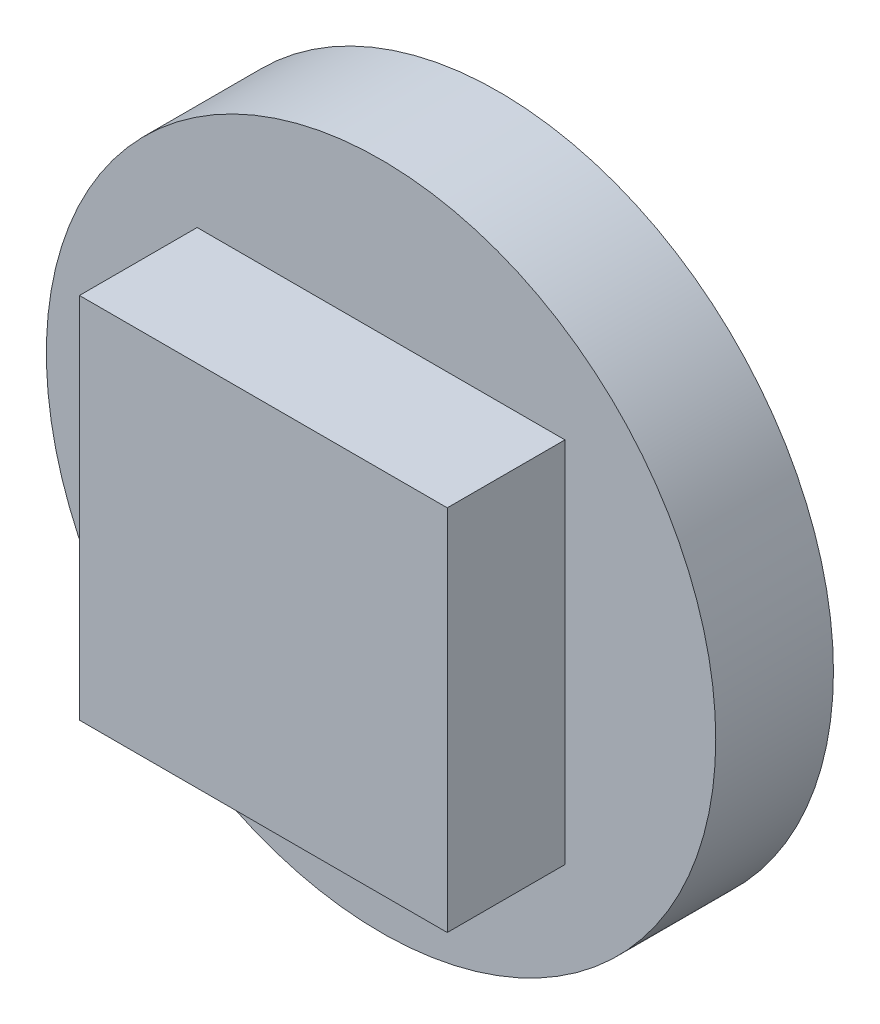
ISO-10303-21;
HEADER;
FILE_DESCRIPTION(('STEP AP214'),'2;1');
FILE_NAME('part.step','',(''),(''),'','','');
FILE_SCHEMA(('AUTOMOTIVE_DESIGN { 1 0 10303 214 1 1 1 1 }'));
ENDSEC;
DATA;
#1=APPLICATION_CONTEXT('core data for automotive mechanical design processes');
#2=APPLICATION_PROTOCOL_DEFINITION('international standard','automotive_design',2000,#1);
#3=PRODUCT_CONTEXT('',#1,'mechanical');
#4=PRODUCT('Part','Part','',(#3));
#5=PRODUCT_RELATED_PRODUCT_CATEGORY('part','',(#4));
#6=PRODUCT_DEFINITION_FORMATION('','',#4);
#7=PRODUCT_DEFINITION_CONTEXT('part definition',#1,'design');
#8=PRODUCT_DEFINITION('design','',#6,#7);
#9=PRODUCT_DEFINITION_SHAPE('','',#8);
#10=(LENGTH_UNIT() NAMED_UNIT(*) SI_UNIT(.MILLI.,.METRE.));
#11=(NAMED_UNIT(*) PLANE_ANGLE_UNIT() SI_UNIT($,.RADIAN.));
#12=(NAMED_UNIT(*) SI_UNIT($,.STERADIAN.) SOLID_ANGLE_UNIT());
#13=UNCERTAINTY_MEASURE_WITH_UNIT(LENGTH_MEASURE(1.E-05),#10,'distance_accuracy_value','');
#14=(GEOMETRIC_REPRESENTATION_CONTEXT(3) GLOBAL_UNCERTAINTY_ASSIGNED_CONTEXT((#13)) GLOBAL_UNIT_ASSIGNED_CONTEXT((#10,
#11,#12)) REPRESENTATION_CONTEXT('',''));
#15=CARTESIAN_POINT('',(0.,0.,0.));
#16=DIRECTION('',(0.,0.,1.));
#17=DIRECTION('',(1.,0.,0.));
#18=AXIS2_PLACEMENT_3D('',#15,#16,#17);
#19=CARTESIAN_POINT('',(0.,0.,1.6));
#20=DIRECTION('',(0.,0.,-1.));
#21=DIRECTION('',(-1.,0.,0.));
#22=AXIS2_PLACEMENT_3D('',#19,#20,#21);
#23=CYLINDRICAL_SURFACE('',#22,4.55);
#24=CARTESIAN_POINT('',(0.,0.,1.6));
#25=DIRECTION('',(0.,0.,1.));
#26=DIRECTION('',(1.,0.,0.));
#27=AXIS2_PLACEMENT_3D('',#24,#25,#26);
#28=CIRCLE('',#27,4.55);
#29=CARTESIAN_POINT('',(4.55,0.,1.6));
#30=VERTEX_POINT('',#29);
#31=EDGE_CURVE('E11',#30,#30,#28,.T.);
#32=ORIENTED_EDGE('',*,*,#31,.F.);
#33=EDGE_LOOP('',(#32));
#34=FACE_BOUND('',#33,.T.);
#35=CARTESIAN_POINT('',(0.,0.,0.));
#36=DIRECTION('',(0.,0.,1.));
#37=DIRECTION('',(1.,0.,0.));
#38=AXIS2_PLACEMENT_3D('',#35,#36,#37);
#39=CIRCLE('',#38,4.55);
#40=CARTESIAN_POINT('',(4.55,0.,0.));
#41=VERTEX_POINT('',#40);
#42=EDGE_CURVE('E40',#41,#41,#39,.T.);
#43=ORIENTED_EDGE('',*,*,#42,.T.);
#44=EDGE_LOOP('',(#43));
#45=FACE_BOUND('',#44,.T.);
#46=ADVANCED_FACE('F37',(#34,#45),#23,.T.);
#47=CARTESIAN_POINT('',(0.,0.,1.6));
#48=DIRECTION('',(0.,0.,1.));
#49=DIRECTION('',(1.,0.,0.));
#50=AXIS2_PLACEMENT_3D('',#47,#48,#49);
#51=PLANE('',#50);
#52=DIRECTION('',(0.,1.,0.));
#53=VECTOR('',#52,1.);
#54=CARTESIAN_POINT('',(2.5,2.5,1.6));
#55=LINE('',#54,#53);
#56=CARTESIAN_POINT('',(2.50000000000001,-2.50000000000001,1.6));
#57=VERTEX_POINT('',#56);
#58=CARTESIAN_POINT('',(2.5,2.5,1.6));
#59=VERTEX_POINT('',#58);
#60=EDGE_CURVE('E51',#57,#59,#55,.T.);
#61=ORIENTED_EDGE('',*,*,#60,.F.);
#62=DIRECTION('',(1.,0.,0.));
#63=VECTOR('',#62,1.);
#64=CARTESIAN_POINT('',(-2.5,-2.50000000000001,1.6));
#65=LINE('',#64,#63);
#66=CARTESIAN_POINT('',(-2.5,-2.50000000000001,1.6));
#67=VERTEX_POINT('',#66);
#68=EDGE_CURVE('E55',#67,#57,#65,.T.);
#69=ORIENTED_EDGE('',*,*,#68,.F.);
#70=DIRECTION('',(0.,-1.,0.));
#71=VECTOR('',#70,1.);
#72=CARTESIAN_POINT('',(-2.5,2.5,1.6));
#73=LINE('',#72,#71);
#74=CARTESIAN_POINT('',(-2.5,2.5,1.6));
#75=VERTEX_POINT('',#74);
#76=EDGE_CURVE('E107',#75,#67,#73,.T.);
#77=ORIENTED_EDGE('',*,*,#76,.F.);
#78=DIRECTION('',(-1.,0.,0.));
#79=VECTOR('',#78,1.);
#80=CARTESIAN_POINT('',(-2.5,2.5,1.6));
#81=LINE('',#80,#79);
#82=EDGE_CURVE('E109',#59,#75,#81,.T.);
#83=ORIENTED_EDGE('',*,*,#82,.F.);
#84=EDGE_LOOP('',(#61,#69,#77,#83));
#85=FACE_BOUND('',#84,.T.);
#86=ORIENTED_EDGE('',*,*,#31,.T.);
#87=EDGE_LOOP('',(#86));
#88=FACE_BOUND('',#87,.T.);
#89=ADVANCED_FACE('F127',(#85,#88),#51,.T.);
#90=CARTESIAN_POINT('',(0.,0.,0.));
#91=DIRECTION('',(0.,0.,1.));
#92=DIRECTION('',(1.,0.,0.));
#93=AXIS2_PLACEMENT_3D('',#90,#91,#92);
#94=PLANE('',#93);
#95=ORIENTED_EDGE('',*,*,#42,.F.);
#96=EDGE_LOOP('',(#95));
#97=FACE_BOUND('',#96,.T.);
#98=ADVANCED_FACE('F132',(#97),#94,.F.);
#99=CARTESIAN_POINT('',(2.5,2.5,3.2));
#100=DIRECTION('',(-1.,0.,0.));
#101=DIRECTION('',(0.,-1.,0.));
#102=AXIS2_PLACEMENT_3D('',#99,#100,#101);
#103=PLANE('',#102);
#104=ORIENTED_EDGE('',*,*,#60,.T.);
#105=DIRECTION('',(0.,0.,-1.));
#106=VECTOR('',#105,1.);
#107=CARTESIAN_POINT('',(2.5,2.5,3.2));
#108=LINE('',#107,#106);
#109=CARTESIAN_POINT('',(2.5,2.5,3.2));
#110=VERTEX_POINT('',#109);
#111=EDGE_CURVE('E80',#110,#59,#108,.T.);
#112=ORIENTED_EDGE('',*,*,#111,.F.);
#113=DIRECTION('',(0.,1.,0.));
#114=VECTOR('',#113,1.);
#115=CARTESIAN_POINT('',(2.5,2.5,3.2));
#116=LINE('',#115,#114);
#117=CARTESIAN_POINT('',(2.50000000000001,-2.50000000000001,3.2));
#118=VERTEX_POINT('',#117);
#119=EDGE_CURVE('E86',#118,#110,#116,.T.);
#120=ORIENTED_EDGE('',*,*,#119,.F.);
#121=DIRECTION('',(0.,0.,-1.));
#122=VECTOR('',#121,1.);
#123=CARTESIAN_POINT('',(2.50000000000001,-2.50000000000001,3.2));
#124=LINE('',#123,#122);
#125=EDGE_CURVE('E104',#118,#57,#124,.T.);
#126=ORIENTED_EDGE('',*,*,#125,.T.);
#127=EDGE_LOOP('',(#104,#112,#120,#126));
#128=FACE_BOUND('',#127,.T.);
#129=ADVANCED_FACE('F96',(#128),#103,.F.);
#130=CARTESIAN_POINT('',(-2.5,2.5,3.2));
#131=DIRECTION('',(0.,-1.,0.));
#132=DIRECTION('',(0.,0.,-1.));
#133=AXIS2_PLACEMENT_3D('',#130,#131,#132);
#134=PLANE('',#133);
#135=ORIENTED_EDGE('',*,*,#82,.T.);
#136=DIRECTION('',(0.,0.,-1.));
#137=VECTOR('',#136,1.);
#138=CARTESIAN_POINT('',(-2.5,2.5,3.2));
#139=LINE('',#138,#137);
#140=CARTESIAN_POINT('',(-2.5,2.5,3.2));
#141=VERTEX_POINT('',#140);
#142=EDGE_CURVE('E82',#141,#75,#139,.T.);
#143=ORIENTED_EDGE('',*,*,#142,.F.);
#144=DIRECTION('',(-1.,0.,0.));
#145=VECTOR('',#144,1.);
#146=CARTESIAN_POINT('',(-2.5,2.5,3.2));
#147=LINE('',#146,#145);
#148=EDGE_CURVE('E75',#110,#141,#147,.T.);
#149=ORIENTED_EDGE('',*,*,#148,.F.);
#150=ORIENTED_EDGE('',*,*,#111,.T.);
#151=EDGE_LOOP('',(#135,#143,#149,#150));
#152=FACE_BOUND('',#151,.T.);
#153=ADVANCED_FACE('F78',(#152),#134,.F.);
#154=CARTESIAN_POINT('',(-2.5,2.5,3.2));
#155=DIRECTION('',(1.,0.,0.));
#156=DIRECTION('',(0.,0.,-1.));
#157=AXIS2_PLACEMENT_3D('',#154,#155,#156);
#158=PLANE('',#157);
#159=ORIENTED_EDGE('',*,*,#76,.T.);
#160=DIRECTION('',(0.,0.,-1.));
#161=VECTOR('',#160,1.);
#162=CARTESIAN_POINT('',(-2.5,-2.50000000000001,3.2));
#163=LINE('',#162,#161);
#164=CARTESIAN_POINT('',(-2.5,-2.50000000000001,3.2));
#165=VERTEX_POINT('',#164);
#166=EDGE_CURVE('E99',#165,#67,#163,.T.);
#167=ORIENTED_EDGE('',*,*,#166,.F.);
#168=DIRECTION('',(0.,-1.,0.));
#169=VECTOR('',#168,1.);
#170=CARTESIAN_POINT('',(-2.5,2.5,3.2));
#171=LINE('',#170,#169);
#172=EDGE_CURVE('E85',#141,#165,#171,.T.);
#173=ORIENTED_EDGE('',*,*,#172,.F.);
#174=ORIENTED_EDGE('',*,*,#142,.T.);
#175=EDGE_LOOP('',(#159,#167,#173,#174));
#176=FACE_BOUND('',#175,.T.);
#177=ADVANCED_FACE('F115',(#176),#158,.F.);
#178=CARTESIAN_POINT('',(-2.5,-2.50000000000001,3.2));
#179=DIRECTION('',(0.,1.,0.));
#180=DIRECTION('',(0.,0.,1.));
#181=AXIS2_PLACEMENT_3D('',#178,#179,#180);
#182=PLANE('',#181);
#183=ORIENTED_EDGE('',*,*,#68,.T.);
#184=ORIENTED_EDGE('',*,*,#125,.F.);
#185=DIRECTION('',(1.,0.,0.));
#186=VECTOR('',#185,1.);
#187=CARTESIAN_POINT('',(-2.5,-2.50000000000001,3.2));
#188=LINE('',#187,#186);
#189=EDGE_CURVE('E91',#165,#118,#188,.T.);
#190=ORIENTED_EDGE('',*,*,#189,.F.);
#191=ORIENTED_EDGE('',*,*,#166,.T.);
#192=EDGE_LOOP('',(#183,#184,#190,#191));
#193=FACE_BOUND('',#192,.T.);
#194=ADVANCED_FACE('F117',(#193),#182,.F.);
#195=CARTESIAN_POINT('',(0.,0.,3.2));
#196=DIRECTION('',(0.,0.,1.));
#197=DIRECTION('',(1.,0.,0.));
#198=AXIS2_PLACEMENT_3D('',#195,#196,#197);
#199=PLANE('',#198);
#200=ORIENTED_EDGE('',*,*,#119,.T.);
#201=ORIENTED_EDGE('',*,*,#148,.T.);
#202=ORIENTED_EDGE('',*,*,#172,.T.);
#203=ORIENTED_EDGE('',*,*,#189,.T.);
#204=EDGE_LOOP('',(#200,#201,#202,#203));
#205=FACE_BOUND('',#204,.T.);
#206=ADVANCED_FACE('F89',(#205),#199,.T.);
#207=CLOSED_SHELL('',(#46,#89,#98,#129,#153,#177,#194,#206));
#208=MANIFOLD_SOLID_BREP('B2',#207);
#209=ADVANCED_BREP_SHAPE_REPRESENTATION('',(#18,#208),#14);
#210=SHAPE_DEFINITION_REPRESENTATION(#9,#209);
ENDSEC;
END-ISO-10303-21;
